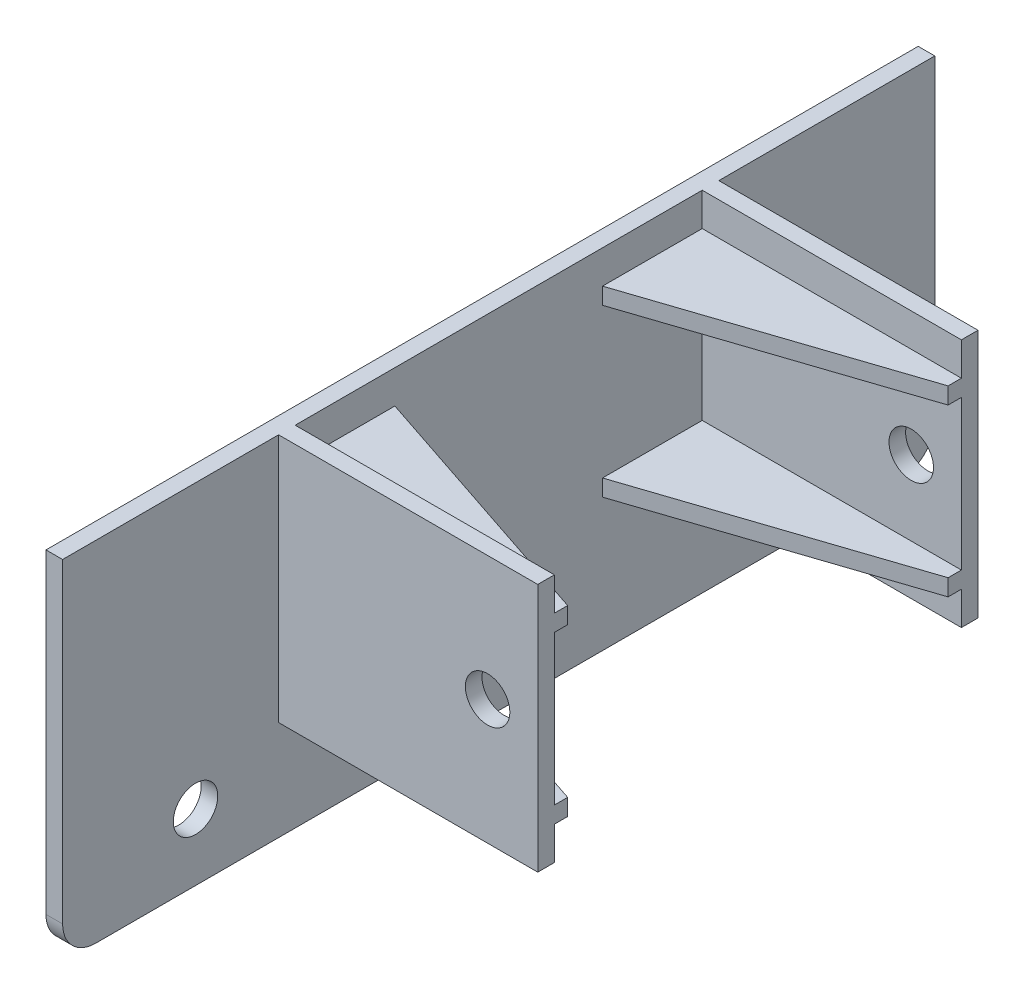
ISO-10303-21;
HEADER;
FILE_DESCRIPTION(('STEP AP214'),'2;1');
FILE_NAME('part.step','',(''),(''),'','','');
FILE_SCHEMA(('AUTOMOTIVE_DESIGN { 1 0 10303 214 1 1 1 1 }'));
ENDSEC;
DATA;
#1=APPLICATION_CONTEXT('core data for automotive mechanical design processes');
#2=APPLICATION_PROTOCOL_DEFINITION('international standard','automotive_design',2000,#1);
#3=PRODUCT_CONTEXT('',#1,'mechanical');
#4=PRODUCT('Part','Part','',(#3));
#5=PRODUCT_RELATED_PRODUCT_CATEGORY('part','',(#4));
#6=PRODUCT_DEFINITION_FORMATION('','',#4);
#7=PRODUCT_DEFINITION_CONTEXT('part definition',#1,'design');
#8=PRODUCT_DEFINITION('design','',#6,#7);
#9=PRODUCT_DEFINITION_SHAPE('','',#8);
#10=(LENGTH_UNIT() NAMED_UNIT(*) SI_UNIT(.MILLI.,.METRE.));
#11=(NAMED_UNIT(*) PLANE_ANGLE_UNIT() SI_UNIT($,.RADIAN.));
#12=(NAMED_UNIT(*) SI_UNIT($,.STERADIAN.) SOLID_ANGLE_UNIT());
#13=UNCERTAINTY_MEASURE_WITH_UNIT(LENGTH_MEASURE(1.E-05),#10,'distance_accuracy_value','');
#14=(GEOMETRIC_REPRESENTATION_CONTEXT(3) GLOBAL_UNCERTAINTY_ASSIGNED_CONTEXT((#13)) GLOBAL_UNIT_ASSIGNED_CONTEXT((#10,
#11,#12)) REPRESENTATION_CONTEXT('',''));
#15=CARTESIAN_POINT('',(0.,0.,0.));
#16=DIRECTION('',(0.,0.,1.));
#17=DIRECTION('',(1.,0.,0.));
#18=AXIS2_PLACEMENT_3D('',#15,#16,#17);
#19=CARTESIAN_POINT('',(0.,0.,66.675));
#20=DIRECTION('',(-1.,0.,0.));
#21=DIRECTION('',(0.,0.,1.));
#22=AXIS2_PLACEMENT_3D('',#19,#20,#21);
#23=PLANE('',#22);
#24=DIRECTION('',(0.,0.,-1.));
#25=VECTOR('',#24,1.);
#26=CARTESIAN_POINT('',(0.,22.86,17.78));
#27=LINE('',#26,#25);
#28=CARTESIAN_POINT('',(0.,22.86,25.4));
#29=VERTEX_POINT('',#28);
#30=CARTESIAN_POINT('',(0.,22.86,17.78));
#31=VERTEX_POINT('',#30);
#32=EDGE_CURVE('E347',#29,#31,#27,.T.);
#33=ORIENTED_EDGE('',*,*,#32,.F.);
#34=DIRECTION('',(0.,-1.,0.));
#35=VECTOR('',#34,1.);
#36=CARTESIAN_POINT('',(0.,24.13,25.4));
#37=LINE('',#36,#35);
#38=CARTESIAN_POINT('',(0.,24.13,25.4));
#39=VERTEX_POINT('',#38);
#40=EDGE_CURVE('E343',#39,#29,#37,.T.);
#41=ORIENTED_EDGE('',*,*,#40,.F.);
#42=DIRECTION('',(0.,0.,1.));
#43=VECTOR('',#42,1.);
#44=CARTESIAN_POINT('',(0.,24.13,17.78));
#45=LINE('',#44,#43);
#46=CARTESIAN_POINT('',(0.,24.13,17.78));
#47=VERTEX_POINT('',#46);
#48=EDGE_CURVE('E339',#47,#39,#45,.T.);
#49=ORIENTED_EDGE('',*,*,#48,.F.);
#50=DIRECTION('',(0.,1.,0.));
#51=VECTOR('',#50,1.);
#52=CARTESIAN_POINT('',(0.,7.61999999999998,17.78));
#53=LINE('',#52,#51);
#54=CARTESIAN_POINT('',(0.,26.67,17.78));
#55=VERTEX_POINT('',#54);
#56=EDGE_CURVE('E411',#47,#55,#53,.T.);
#57=ORIENTED_EDGE('',*,*,#56,.T.);
#58=DIRECTION('',(0.,0.,1.));
#59=VECTOR('',#58,1.);
#60=CARTESIAN_POINT('',(0.,26.67,66.675));
#61=LINE('',#60,#59);
#62=CARTESIAN_POINT('',(0.,26.67,48.895));
#63=VERTEX_POINT('',#62);
#64=EDGE_CURVE('E269',#55,#63,#61,.T.);
#65=ORIENTED_EDGE('',*,*,#64,.T.);
#66=DIRECTION('',(0.,1.,0.));
#67=VECTOR('',#66,1.);
#68=CARTESIAN_POINT('',(0.,7.61999999999998,48.895));
#69=LINE('',#68,#67);
#70=CARTESIAN_POINT('',(0.,24.13,48.895));
#71=VERTEX_POINT('',#70);
#72=EDGE_CURVE('E428',#71,#63,#69,.T.);
#73=ORIENTED_EDGE('',*,*,#72,.F.);
#74=DIRECTION('',(0.,0.,1.));
#75=VECTOR('',#74,1.);
#76=CARTESIAN_POINT('',(0.,24.13,48.895));
#77=LINE('',#76,#75);
#78=CARTESIAN_POINT('',(0.,24.13,41.275));
#79=VERTEX_POINT('',#78);
#80=EDGE_CURVE('E329',#79,#71,#77,.T.);
#81=ORIENTED_EDGE('',*,*,#80,.F.);
#82=DIRECTION('',(0.,1.,0.));
#83=VECTOR('',#82,1.);
#84=CARTESIAN_POINT('',(0.,24.13,41.275));
#85=LINE('',#84,#83);
#86=CARTESIAN_POINT('',(0.,22.86,41.275));
#87=VERTEX_POINT('',#86);
#88=EDGE_CURVE('E325',#87,#79,#85,.T.);
#89=ORIENTED_EDGE('',*,*,#88,.F.);
#90=DIRECTION('',(0.,0.,-1.));
#91=VECTOR('',#90,1.);
#92=CARTESIAN_POINT('',(0.,22.86,48.895));
#93=LINE('',#92,#91);
#94=CARTESIAN_POINT('',(0.,22.86,48.895));
#95=VERTEX_POINT('',#94);
#96=EDGE_CURVE('E321',#95,#87,#93,.T.);
#97=ORIENTED_EDGE('',*,*,#96,.F.);
#98=CARTESIAN_POINT('',(0.,11.43,48.895));
#99=VERTEX_POINT('',#98);
#100=EDGE_CURVE('E434',#99,#95,#69,.T.);
#101=ORIENTED_EDGE('',*,*,#100,.F.);
#102=DIRECTION('',(0.,0.,1.));
#103=VECTOR('',#102,1.);
#104=CARTESIAN_POINT('',(0.,11.43,48.895));
#105=LINE('',#104,#103);
#106=CARTESIAN_POINT('',(0.,11.43,41.275));
#107=VERTEX_POINT('',#106);
#108=EDGE_CURVE('E382',#107,#99,#105,.T.);
#109=ORIENTED_EDGE('',*,*,#108,.F.);
#110=DIRECTION('',(0.,1.,0.));
#111=VECTOR('',#110,1.);
#112=CARTESIAN_POINT('',(0.,10.16,41.275));
#113=LINE('',#112,#111);
#114=CARTESIAN_POINT('',(0.,10.16,41.275));
#115=VERTEX_POINT('',#114);
#116=EDGE_CURVE('E378',#115,#107,#113,.T.);
#117=ORIENTED_EDGE('',*,*,#116,.F.);
#118=DIRECTION('',(0.,0.,-1.));
#119=VECTOR('',#118,1.);
#120=CARTESIAN_POINT('',(0.,10.16,48.895));
#121=LINE('',#120,#119);
#122=CARTESIAN_POINT('',(0.,10.16,48.895));
#123=VERTEX_POINT('',#122);
#124=EDGE_CURVE('E374',#123,#115,#121,.T.);
#125=ORIENTED_EDGE('',*,*,#124,.F.);
#126=CARTESIAN_POINT('',(0.,7.61999999999998,48.895));
#127=VERTEX_POINT('',#126);
#128=EDGE_CURVE('E429',#127,#123,#69,.T.);
#129=ORIENTED_EDGE('',*,*,#128,.F.);
#130=DIRECTION('',(0.,0.,-1.));
#131=VECTOR('',#130,1.);
#132=CARTESIAN_POINT('',(0.,7.61999999999998,50.165));
#133=LINE('',#132,#131);
#134=CARTESIAN_POINT('',(0.,7.61999999999998,50.165));
#135=VERTEX_POINT('',#134);
#136=EDGE_CURVE('E420',#135,#127,#133,.T.);
#137=ORIENTED_EDGE('',*,*,#136,.F.);
#138=DIRECTION('',(0.,1.,0.));
#139=VECTOR('',#138,1.);
#140=CARTESIAN_POINT('',(0.,7.61999999999998,50.165));
#141=LINE('',#140,#139);
#142=CARTESIAN_POINT('',(0.,26.67,50.165));
#143=VERTEX_POINT('',#142);
#144=EDGE_CURVE('E433',#135,#143,#141,.T.);
#145=ORIENTED_EDGE('',*,*,#144,.T.);
#146=DIRECTION('',(0.,0.,1.));
#147=VECTOR('',#146,1.);
#148=CARTESIAN_POINT('',(0.,26.67,66.675));
#149=LINE('',#148,#147);
#150=CARTESIAN_POINT('',(0.,26.67,66.675));
#151=VERTEX_POINT('',#150);
#152=EDGE_CURVE('E395',#143,#151,#149,.T.);
#153=ORIENTED_EDGE('',*,*,#152,.T.);
#154=DIRECTION('',(0.,1.,0.));
#155=VECTOR('',#154,1.);
#156=CARTESIAN_POINT('',(0.,0.,66.675));
#157=LINE('',#156,#155);
#158=CARTESIAN_POINT('',(0.,2.54,66.675));
#159=VERTEX_POINT('',#158);
#160=EDGE_CURVE('E463',#159,#151,#157,.T.);
#161=ORIENTED_EDGE('',*,*,#160,.F.);
#162=CARTESIAN_POINT('',(0.,2.54,64.135));
#163=DIRECTION('',(-1.,0.,0.));
#164=DIRECTION('',(0.,0.,1.));
#165=AXIS2_PLACEMENT_3D('',#162,#163,#164);
#166=CIRCLE('',#165,2.54);
#167=CARTESIAN_POINT('',(0.,0.,64.135));
#168=VERTEX_POINT('',#167);
#169=EDGE_CURVE('E503',#159,#168,#166,.F.);
#170=ORIENTED_EDGE('',*,*,#169,.T.);
#171=DIRECTION('',(0.,0.,-1.));
#172=VECTOR('',#171,1.);
#173=CARTESIAN_POINT('',(0.,0.,66.675));
#174=LINE('',#173,#172);
#175=CARTESIAN_POINT('',(0.,0.,2.54));
#176=VERTEX_POINT('',#175);
#177=EDGE_CURVE('E475',#168,#176,#174,.T.);
#178=ORIENTED_EDGE('',*,*,#177,.T.);
#179=CARTESIAN_POINT('',(0.,2.54,2.54));
#180=DIRECTION('',(-1.,0.,0.));
#181=DIRECTION('',(0.,0.,1.));
#182=AXIS2_PLACEMENT_3D('',#179,#180,#181);
#183=CIRCLE('',#182,2.54);
#184=CARTESIAN_POINT('',(0.,2.54,0.));
#185=VERTEX_POINT('',#184);
#186=EDGE_CURVE('E506',#176,#185,#183,.F.);
#187=ORIENTED_EDGE('',*,*,#186,.T.);
#188=DIRECTION('',(0.,1.,0.));
#189=VECTOR('',#188,1.);
#190=CARTESIAN_POINT('',(0.,0.,0.));
#191=LINE('',#190,#189);
#192=CARTESIAN_POINT('',(0.,26.67,0.));
#193=VERTEX_POINT('',#192);
#194=EDGE_CURVE('E459',#185,#193,#191,.T.);
#195=ORIENTED_EDGE('',*,*,#194,.T.);
#196=DIRECTION('',(0.,0.,1.));
#197=VECTOR('',#196,1.);
#198=CARTESIAN_POINT('',(0.,26.67,66.675));
#199=LINE('',#198,#197);
#200=CARTESIAN_POINT('',(0.,26.67,16.51));
#201=VERTEX_POINT('',#200);
#202=EDGE_CURVE('E392',#193,#201,#199,.T.);
#203=ORIENTED_EDGE('',*,*,#202,.T.);
#204=DIRECTION('',(0.,1.,0.));
#205=VECTOR('',#204,1.);
#206=CARTESIAN_POINT('',(0.,7.61999999999998,16.51));
#207=LINE('',#206,#205);
#208=CARTESIAN_POINT('',(0.,7.61999999999998,16.51));
#209=VERTEX_POINT('',#208);
#210=EDGE_CURVE('E261',#209,#201,#207,.T.);
#211=ORIENTED_EDGE('',*,*,#210,.F.);
#212=DIRECTION('',(0.,0.,-1.));
#213=VECTOR('',#212,1.);
#214=CARTESIAN_POINT('',(0.,7.61999999999998,16.51));
#215=LINE('',#214,#213);
#216=CARTESIAN_POINT('',(0.,7.61999999999998,17.78));
#217=VERTEX_POINT('',#216);
#218=EDGE_CURVE('E402',#217,#209,#215,.T.);
#219=ORIENTED_EDGE('',*,*,#218,.F.);
#220=CARTESIAN_POINT('',(0.,10.16,17.78));
#221=VERTEX_POINT('',#220);
#222=EDGE_CURVE('E412',#217,#221,#53,.T.);
#223=ORIENTED_EDGE('',*,*,#222,.T.);
#224=DIRECTION('',(0.,0.,-1.));
#225=VECTOR('',#224,1.);
#226=CARTESIAN_POINT('',(0.,10.16,17.78));
#227=LINE('',#226,#225);
#228=CARTESIAN_POINT('',(0.,10.16,25.4));
#229=VERTEX_POINT('',#228);
#230=EDGE_CURVE('E364',#229,#221,#227,.T.);
#231=ORIENTED_EDGE('',*,*,#230,.F.);
#232=DIRECTION('',(0.,-1.,0.));
#233=VECTOR('',#232,1.);
#234=CARTESIAN_POINT('',(0.,10.16,25.4));
#235=LINE('',#234,#233);
#236=CARTESIAN_POINT('',(0.,11.43,25.4));
#237=VERTEX_POINT('',#236);
#238=EDGE_CURVE('E361',#237,#229,#235,.T.);
#239=ORIENTED_EDGE('',*,*,#238,.F.);
#240=DIRECTION('',(0.,0.,1.));
#241=VECTOR('',#240,1.);
#242=CARTESIAN_POINT('',(0.,11.43,17.78));
#243=LINE('',#242,#241);
#244=CARTESIAN_POINT('',(0.,11.43,17.78));
#245=VERTEX_POINT('',#244);
#246=EDGE_CURVE('E357',#245,#237,#243,.T.);
#247=ORIENTED_EDGE('',*,*,#246,.F.);
#248=EDGE_CURVE('E417',#245,#31,#53,.T.);
#249=ORIENTED_EDGE('',*,*,#248,.T.);
#250=EDGE_LOOP('',(#33,#41,#49,#57,#65,#73,#81,#89,#97,#101,#109,#117,#125,#129,#137,#145,#153,
#161,#170,#178,#187,#195,#203,#211,#219,#223,#231,#239,#247,#249));
#251=FACE_BOUND('',#250,.T.);
#252=CARTESIAN_POINT('',(0.,5.08,10.16));
#253=DIRECTION('',(-1.,0.,0.));
#254=DIRECTION('',(0.,0.,1.));
#255=AXIS2_PLACEMENT_3D('',#252,#253,#254);
#256=CIRCLE('',#255,1.7);
#257=CARTESIAN_POINT('',(0.,5.08,11.86));
#258=VERTEX_POINT('',#257);
#259=EDGE_CURVE('E450',#258,#258,#256,.T.);
#260=ORIENTED_EDGE('',*,*,#259,.T.);
#261=EDGE_LOOP('',(#260));
#262=FACE_BOUND('',#261,.T.);
#263=CARTESIAN_POINT('',(0.,5.08,56.515));
#264=DIRECTION('',(-1.,0.,0.));
#265=DIRECTION('',(0.,0.,1.));
#266=AXIS2_PLACEMENT_3D('',#263,#264,#265);
#267=CIRCLE('',#266,1.7);
#268=CARTESIAN_POINT('',(0.,5.08,58.215));
#269=VERTEX_POINT('',#268);
#270=EDGE_CURVE('E443',#269,#269,#267,.T.);
#271=ORIENTED_EDGE('',*,*,#270,.T.);
#272=EDGE_LOOP('',(#271));
#273=FACE_BOUND('',#272,.T.);
#274=ADVANCED_FACE('F40',(#251,#262,#273),#23,.F.);
#275=CARTESIAN_POINT('',(22.86,7.61999999999998,48.895));
#276=DIRECTION('',(0.,0.,1.));
#277=DIRECTION('',(1.,0.,0.));
#278=AXIS2_PLACEMENT_3D('',#275,#276,#277);
#279=PLANE('',#278);
#280=CARTESIAN_POINT('',(15.9783518217895,17.145,48.895));
#281=DIRECTION('',(0.,0.,1.));
#282=DIRECTION('',(1.,0.,0.));
#283=AXIS2_PLACEMENT_3D('',#280,#281,#282);
#284=CIRCLE('',#283,1.7);
#285=CARTESIAN_POINT('',(17.6783518217895,17.145,48.895));
#286=VERTEX_POINT('',#285);
#287=EDGE_CURVE('E284',#286,#286,#284,.T.);
#288=ORIENTED_EDGE('',*,*,#287,.T.);
#289=EDGE_LOOP('',(#288));
#290=FACE_BOUND('',#289,.T.);
#291=DIRECTION('',(-1.,0.,0.));
#292=VECTOR('',#291,1.);
#293=CARTESIAN_POINT('',(22.86,22.86,48.895));
#294=LINE('',#293,#292);
#295=CARTESIAN_POINT('',(19.812,22.86,48.895));
#296=VERTEX_POINT('',#295);
#297=EDGE_CURVE('E336',#296,#95,#294,.T.);
#298=ORIENTED_EDGE('',*,*,#297,.F.);
#299=DIRECTION('',(0.,-1.,0.));
#300=VECTOR('',#299,1.);
#301=CARTESIAN_POINT('',(19.812,7.61999999999998,48.895));
#302=LINE('',#301,#300);
#303=CARTESIAN_POINT('',(19.812,11.43,48.895));
#304=VERTEX_POINT('',#303);
#305=EDGE_CURVE('E552',#296,#304,#302,.T.);
#306=ORIENTED_EDGE('',*,*,#305,.T.);
#307=DIRECTION('',(-1.,0.,0.));
#308=VECTOR('',#307,1.);
#309=CARTESIAN_POINT('',(22.86,11.43,48.895));
#310=LINE('',#309,#308);
#311=EDGE_CURVE('E386',#304,#99,#310,.T.);
#312=ORIENTED_EDGE('',*,*,#311,.T.);
#313=ORIENTED_EDGE('',*,*,#100,.T.);
#314=EDGE_LOOP('',(#298,#306,#312,#313));
#315=FACE_BOUND('',#314,.T.);
#316=ADVANCED_FACE('F684',(#290,#315),#279,.F.);
#317=DIRECTION('',(1.,0.,0.));
#318=VECTOR('',#317,1.);
#319=CARTESIAN_POINT('',(-1.27000000000001,26.67,48.895));
#320=LINE('',#319,#318);
#321=CARTESIAN_POINT('',(19.812,26.67,48.895));
#322=VERTEX_POINT('',#321);
#323=EDGE_CURVE('E515',#63,#322,#320,.T.);
#324=ORIENTED_EDGE('',*,*,#323,.T.);
#325=DIRECTION('',(0.,-1.,0.));
#326=VECTOR('',#325,1.);
#327=CARTESIAN_POINT('',(19.812,7.61999999999998,48.895));
#328=LINE('',#327,#326);
#329=CARTESIAN_POINT('',(19.812,24.13,48.895));
#330=VERTEX_POINT('',#329);
#331=EDGE_CURVE('E572',#322,#330,#328,.T.);
#332=ORIENTED_EDGE('',*,*,#331,.T.);
#333=DIRECTION('',(-1.,0.,0.));
#334=VECTOR('',#333,1.);
#335=CARTESIAN_POINT('',(22.86,24.13,48.895));
#336=LINE('',#335,#334);
#337=EDGE_CURVE('E333',#330,#71,#336,.T.);
#338=ORIENTED_EDGE('',*,*,#337,.T.);
#339=ORIENTED_EDGE('',*,*,#72,.T.);
#340=EDGE_LOOP('',(#324,#332,#338,#339));
#341=FACE_BOUND('',#340,.T.);
#342=ADVANCED_FACE('F530',(#341),#279,.F.);
#343=CARTESIAN_POINT('',(22.86,7.61999999999998,17.78));
#344=DIRECTION('',(0.,0.,-1.));
#345=DIRECTION('',(-1.,0.,0.));
#346=AXIS2_PLACEMENT_3D('',#343,#344,#345);
#347=PLANE('',#346);
#348=DIRECTION('',(-1.,0.,0.));
#349=VECTOR('',#348,1.);
#350=CARTESIAN_POINT('',(22.86,24.13,17.78));
#351=LINE('',#350,#349);
#352=CARTESIAN_POINT('',(19.812,24.13,17.78));
#353=VERTEX_POINT('',#352);
#354=EDGE_CURVE('E351',#353,#47,#351,.T.);
#355=ORIENTED_EDGE('',*,*,#354,.F.);
#356=DIRECTION('',(0.,1.,0.));
#357=VECTOR('',#356,1.);
#358=CARTESIAN_POINT('',(19.812,7.61999999999998,17.78));
#359=LINE('',#358,#357);
#360=CARTESIAN_POINT('',(19.812,26.67,17.78));
#361=VERTEX_POINT('',#360);
#362=EDGE_CURVE('E287',#353,#361,#359,.T.);
#363=ORIENTED_EDGE('',*,*,#362,.T.);
#364=DIRECTION('',(-1.,0.,0.));
#365=VECTOR('',#364,1.);
#366=CARTESIAN_POINT('',(-1.26999999999997,26.67,17.78));
#367=LINE('',#366,#365);
#368=EDGE_CURVE('E256',#361,#55,#367,.T.);
#369=ORIENTED_EDGE('',*,*,#368,.T.);
#370=ORIENTED_EDGE('',*,*,#56,.F.);
#371=EDGE_LOOP('',(#355,#363,#369,#370));
#372=FACE_BOUND('',#371,.T.);
#373=ADVANCED_FACE('F607',(#372),#347,.F.);
#374=CARTESIAN_POINT('',(15.9783518217895,17.145,17.78));
#375=DIRECTION('',(0.,0.,-1.));
#376=DIRECTION('',(-1.,0.,0.));
#377=AXIS2_PLACEMENT_3D('',#374,#375,#376);
#378=CIRCLE('',#377,1.7);
#379=CARTESIAN_POINT('',(14.2783518217895,17.145,17.78));
#380=VERTEX_POINT('',#379);
#381=EDGE_CURVE('E277',#380,#380,#378,.T.);
#382=ORIENTED_EDGE('',*,*,#381,.T.);
#383=EDGE_LOOP('',(#382));
#384=FACE_BOUND('',#383,.T.);
#385=DIRECTION('',(-1.,0.,0.));
#386=VECTOR('',#385,1.);
#387=CARTESIAN_POINT('',(22.86,11.43,17.78));
#388=LINE('',#387,#386);
#389=CARTESIAN_POINT('',(19.812,11.43,17.78));
#390=VERTEX_POINT('',#389);
#391=EDGE_CURVE('E371',#390,#245,#388,.T.);
#392=ORIENTED_EDGE('',*,*,#391,.F.);
#393=DIRECTION('',(0.,1.,0.));
#394=VECTOR('',#393,1.);
#395=CARTESIAN_POINT('',(19.812,7.61999999999998,17.78));
#396=LINE('',#395,#394);
#397=CARTESIAN_POINT('',(19.812,22.86,17.78));
#398=VERTEX_POINT('',#397);
#399=EDGE_CURVE('E588',#390,#398,#396,.T.);
#400=ORIENTED_EDGE('',*,*,#399,.T.);
#401=DIRECTION('',(-1.,0.,0.));
#402=VECTOR('',#401,1.);
#403=CARTESIAN_POINT('',(22.86,22.86,17.78));
#404=LINE('',#403,#402);
#405=EDGE_CURVE('E354',#398,#31,#404,.T.);
#406=ORIENTED_EDGE('',*,*,#405,.T.);
#407=ORIENTED_EDGE('',*,*,#248,.F.);
#408=EDGE_LOOP('',(#392,#400,#406,#407));
#409=FACE_BOUND('',#408,.T.);
#410=ADVANCED_FACE('F623',(#384,#409),#347,.F.);
#411=DIRECTION('',(-1.,0.,0.));
#412=VECTOR('',#411,1.);
#413=CARTESIAN_POINT('',(22.86,7.61999999999998,17.78));
#414=LINE('',#413,#412);
#415=CARTESIAN_POINT('',(19.812,7.61999999999998,17.78));
#416=VERTEX_POINT('',#415);
#417=EDGE_CURVE('E399',#416,#217,#414,.T.);
#418=ORIENTED_EDGE('',*,*,#417,.F.);
#419=DIRECTION('',(0.,1.,0.));
#420=VECTOR('',#419,1.);
#421=CARTESIAN_POINT('',(19.812,7.61999999999998,17.78));
#422=LINE('',#421,#420);
#423=CARTESIAN_POINT('',(19.812,10.16,17.78));
#424=VERTEX_POINT('',#423);
#425=EDGE_CURVE('E584',#416,#424,#422,.T.);
#426=ORIENTED_EDGE('',*,*,#425,.T.);
#427=DIRECTION('',(-1.,0.,0.));
#428=VECTOR('',#427,1.);
#429=CARTESIAN_POINT('',(22.86,10.16,17.78));
#430=LINE('',#429,#428);
#431=EDGE_CURVE('E368',#424,#221,#430,.T.);
#432=ORIENTED_EDGE('',*,*,#431,.T.);
#433=ORIENTED_EDGE('',*,*,#222,.F.);
#434=EDGE_LOOP('',(#418,#426,#432,#433));
#435=FACE_BOUND('',#434,.T.);
#436=ADVANCED_FACE('F637',(#435),#347,.F.);
#437=DIRECTION('',(-1.,0.,0.));
#438=VECTOR('',#437,1.);
#439=CARTESIAN_POINT('',(22.86,10.16,48.895));
#440=LINE('',#439,#438);
#441=CARTESIAN_POINT('',(19.812,10.16,48.895));
#442=VERTEX_POINT('',#441);
#443=EDGE_CURVE('E389',#442,#123,#440,.T.);
#444=ORIENTED_EDGE('',*,*,#443,.F.);
#445=DIRECTION('',(0.,-1.,0.));
#446=VECTOR('',#445,1.);
#447=CARTESIAN_POINT('',(19.812,7.61999999999998,48.895));
#448=LINE('',#447,#446);
#449=CARTESIAN_POINT('',(19.812,7.61999999999998,48.895));
#450=VERTEX_POINT('',#449);
#451=EDGE_CURVE('E548',#442,#450,#448,.T.);
#452=ORIENTED_EDGE('',*,*,#451,.T.);
#453=DIRECTION('',(1.,0.,0.));
#454=VECTOR('',#453,1.);
#455=CARTESIAN_POINT('',(22.86,7.61999999999998,48.895));
#456=LINE('',#455,#454);
#457=EDGE_CURVE('E424',#127,#450,#456,.T.);
#458=ORIENTED_EDGE('',*,*,#457,.F.);
#459=ORIENTED_EDGE('',*,*,#128,.T.);
#460=EDGE_LOOP('',(#444,#452,#458,#459));
#461=FACE_BOUND('',#460,.T.);
#462=ADVANCED_FACE('F667',(#461),#279,.F.);
#463=CARTESIAN_POINT('',(0.,0.,66.675));
#464=DIRECTION('',(0.,-1.,0.));
#465=DIRECTION('',(0.,0.,-1.));
#466=AXIS2_PLACEMENT_3D('',#463,#464,#465);
#467=PLANE('',#466);
#468=DIRECTION('',(0.,0.,-1.));
#469=VECTOR('',#468,1.);
#470=CARTESIAN_POINT('',(-1.27,0.,66.675));
#471=LINE('',#470,#469);
#472=CARTESIAN_POINT('',(-1.27,0.,64.135));
#473=VERTEX_POINT('',#472);
#474=CARTESIAN_POINT('',(-1.27,0.,2.54));
#475=VERTEX_POINT('',#474);
#476=EDGE_CURVE('E466',#473,#475,#471,.T.);
#477=ORIENTED_EDGE('',*,*,#476,.T.);
#478=DIRECTION('',(-1.,0.,0.));
#479=VECTOR('',#478,1.);
#480=CARTESIAN_POINT('',(0.,0.,2.54));
#481=LINE('',#480,#479);
#482=EDGE_CURVE('E500',#475,#176,#481,.F.);
#483=ORIENTED_EDGE('',*,*,#482,.T.);
#484=ORIENTED_EDGE('',*,*,#177,.F.);
#485=DIRECTION('',(-1.,0.,0.));
#486=VECTOR('',#485,1.);
#487=CARTESIAN_POINT('',(-1.27,0.,64.135));
#488=LINE('',#487,#486);
#489=EDGE_CURVE('E496',#168,#473,#488,.T.);
#490=ORIENTED_EDGE('',*,*,#489,.T.);
#491=EDGE_LOOP('',(#477,#483,#484,#490));
#492=FACE_BOUND('',#491,.T.);
#493=ADVANCED_FACE('F717',(#492),#467,.T.);
#494=CARTESIAN_POINT('',(-1.27,26.67,66.675));
#495=DIRECTION('',(0.,1.,0.));
#496=DIRECTION('',(0.,0.,1.));
#497=AXIS2_PLACEMENT_3D('',#494,#495,#496);
#498=PLANE('',#497);
#499=DIRECTION('',(0.,0.,1.));
#500=VECTOR('',#499,1.);
#501=CARTESIAN_POINT('',(19.812,26.67,16.51));
#502=LINE('',#501,#500);
#503=CARTESIAN_POINT('',(19.812,26.67,16.51));
#504=VERTEX_POINT('',#503);
#505=EDGE_CURVE('E238',#504,#361,#502,.T.);
#506=ORIENTED_EDGE('',*,*,#505,.F.);
#507=DIRECTION('',(1.,0.,0.));
#508=VECTOR('',#507,1.);
#509=CARTESIAN_POINT('',(-1.27,26.67,16.51));
#510=LINE('',#509,#508);
#511=EDGE_CURVE('E254',#201,#504,#510,.T.);
#512=ORIENTED_EDGE('',*,*,#511,.F.);
#513=ORIENTED_EDGE('',*,*,#202,.F.);
#514=DIRECTION('',(1.,0.,0.));
#515=VECTOR('',#514,1.);
#516=CARTESIAN_POINT('',(-1.27,26.67,0.));
#517=LINE('',#516,#515);
#518=CARTESIAN_POINT('',(-1.27,26.67,0.));
#519=VERTEX_POINT('',#518);
#520=EDGE_CURVE('E469',#519,#193,#517,.T.);
#521=ORIENTED_EDGE('',*,*,#520,.F.);
#522=DIRECTION('',(0.,0.,-1.));
#523=VECTOR('',#522,1.);
#524=CARTESIAN_POINT('',(-1.27,26.67,66.675));
#525=LINE('',#524,#523);
#526=CARTESIAN_POINT('',(-1.27,26.67,66.675));
#527=VERTEX_POINT('',#526);
#528=EDGE_CURVE('E480',#527,#519,#525,.T.);
#529=ORIENTED_EDGE('',*,*,#528,.F.);
#530=DIRECTION('',(1.,0.,0.));
#531=VECTOR('',#530,1.);
#532=CARTESIAN_POINT('',(-1.27,26.67,66.675));
#533=LINE('',#532,#531);
#534=EDGE_CURVE('E458',#527,#151,#533,.T.);
#535=ORIENTED_EDGE('',*,*,#534,.T.);
#536=ORIENTED_EDGE('',*,*,#152,.F.);
#537=DIRECTION('',(-1.,0.,0.));
#538=VECTOR('',#537,1.);
#539=CARTESIAN_POINT('',(-1.27,26.67,50.165));
#540=LINE('',#539,#538);
#541=CARTESIAN_POINT('',(19.812,26.67,50.165));
#542=VERTEX_POINT('',#541);
#543=EDGE_CURVE('E512',#542,#143,#540,.T.);
#544=ORIENTED_EDGE('',*,*,#543,.F.);
#545=EDGE_CURVE('E258',#322,#542,#502,.T.);
#546=ORIENTED_EDGE('',*,*,#545,.F.);
#547=ORIENTED_EDGE('',*,*,#323,.F.);
#548=ORIENTED_EDGE('',*,*,#64,.F.);
#549=ORIENTED_EDGE('',*,*,#368,.F.);
#550=EDGE_LOOP('',(#506,#512,#513,#521,#529,#535,#536,#544,#546,#547,#548,#549));
#551=FACE_BOUND('',#550,.T.);
#552=ADVANCED_FACE('F252',(#551),#498,.T.);
#553=CARTESIAN_POINT('',(-1.27,0.,66.675));
#554=DIRECTION('',(-1.,0.,0.));
#555=DIRECTION('',(0.,-1.,0.));
#556=AXIS2_PLACEMENT_3D('',#553,#554,#555);
#557=PLANE('',#556);
#558=CARTESIAN_POINT('',(-1.27,5.08,10.16));
#559=DIRECTION('',(-1.,0.,0.));
#560=DIRECTION('',(0.,-1.,0.));
#561=AXIS2_PLACEMENT_3D('',#558,#559,#560);
#562=CIRCLE('',#561,1.7);
#563=CARTESIAN_POINT('',(-1.27,3.38,10.16));
#564=VERTEX_POINT('',#563);
#565=EDGE_CURVE('E439',#564,#564,#562,.T.);
#566=ORIENTED_EDGE('',*,*,#565,.F.);
#567=EDGE_LOOP('',(#566));
#568=FACE_BOUND('',#567,.T.);
#569=CARTESIAN_POINT('',(-1.27,5.08,56.515));
#570=DIRECTION('',(-1.,0.,0.));
#571=DIRECTION('',(0.,1.,0.));
#572=AXIS2_PLACEMENT_3D('',#569,#570,#571);
#573=CIRCLE('',#572,1.7);
#574=CARTESIAN_POINT('',(-1.27,6.78,56.515));
#575=VERTEX_POINT('',#574);
#576=EDGE_CURVE('E438',#575,#575,#573,.T.);
#577=ORIENTED_EDGE('',*,*,#576,.F.);
#578=EDGE_LOOP('',(#577));
#579=FACE_BOUND('',#578,.T.);
#580=DIRECTION('',(0.,1.,0.));
#581=VECTOR('',#580,1.);
#582=CARTESIAN_POINT('',(-1.27,0.,0.));
#583=LINE('',#582,#581);
#584=CARTESIAN_POINT('',(-1.27,2.54,0.));
#585=VERTEX_POINT('',#584);
#586=EDGE_CURVE('E454',#585,#519,#583,.T.);
#587=ORIENTED_EDGE('',*,*,#586,.F.);
#588=CARTESIAN_POINT('',(-1.27,2.54,2.54));
#589=DIRECTION('',(-1.,0.,0.));
#590=DIRECTION('',(0.,-1.,0.));
#591=AXIS2_PLACEMENT_3D('',#588,#589,#590);
#592=CIRCLE('',#591,2.54);
#593=EDGE_CURVE('E493',#585,#475,#592,.T.);
#594=ORIENTED_EDGE('',*,*,#593,.T.);
#595=ORIENTED_EDGE('',*,*,#476,.F.);
#596=CARTESIAN_POINT('',(-1.27,2.54,64.135));
#597=DIRECTION('',(-1.,0.,0.));
#598=DIRECTION('',(0.,-1.,0.));
#599=AXIS2_PLACEMENT_3D('',#596,#597,#598);
#600=CIRCLE('',#599,2.54);
#601=CARTESIAN_POINT('',(-1.27,2.54,66.675));
#602=VERTEX_POINT('',#601);
#603=EDGE_CURVE('E490',#473,#602,#600,.T.);
#604=ORIENTED_EDGE('',*,*,#603,.T.);
#605=DIRECTION('',(0.,1.,0.));
#606=VECTOR('',#605,1.);
#607=CARTESIAN_POINT('',(-1.27,0.,66.675));
#608=LINE('',#607,#606);
#609=EDGE_CURVE('E455',#602,#527,#608,.T.);
#610=ORIENTED_EDGE('',*,*,#609,.T.);
#611=ORIENTED_EDGE('',*,*,#528,.T.);
#612=EDGE_LOOP('',(#587,#594,#595,#604,#610,#611));
#613=FACE_BOUND('',#612,.T.);
#614=ADVANCED_FACE('F648',(#568,#579,#613),#557,.T.);
#615=CARTESIAN_POINT('',(0.,0.,66.675));
#616=DIRECTION('',(0.,0.,-1.));
#617=DIRECTION('',(-1.,0.,0.));
#618=AXIS2_PLACEMENT_3D('',#615,#616,#617);
#619=PLANE('',#618);
#620=ORIENTED_EDGE('',*,*,#160,.T.);
#621=ORIENTED_EDGE('',*,*,#534,.F.);
#622=ORIENTED_EDGE('',*,*,#609,.F.);
#623=DIRECTION('',(-1.,0.,0.));
#624=VECTOR('',#623,1.);
#625=CARTESIAN_POINT('',(0.,2.54,66.675));
#626=LINE('',#625,#624);
#627=EDGE_CURVE('E509',#602,#159,#626,.F.);
#628=ORIENTED_EDGE('',*,*,#627,.T.);
#629=EDGE_LOOP('',(#620,#621,#622,#628));
#630=FACE_BOUND('',#629,.T.);
#631=ADVANCED_FACE('F652',(#630),#619,.F.);
#632=CARTESIAN_POINT('',(0.,0.,0.));
#633=DIRECTION('',(0.,0.,-1.));
#634=DIRECTION('',(-1.,0.,0.));
#635=AXIS2_PLACEMENT_3D('',#632,#633,#634);
#636=PLANE('',#635);
#637=ORIENTED_EDGE('',*,*,#520,.T.);
#638=ORIENTED_EDGE('',*,*,#194,.F.);
#639=DIRECTION('',(-1.,0.,0.));
#640=VECTOR('',#639,1.);
#641=CARTESIAN_POINT('',(0.,2.54,0.));
#642=LINE('',#641,#640);
#643=EDGE_CURVE('E479',#185,#585,#642,.T.);
#644=ORIENTED_EDGE('',*,*,#643,.T.);
#645=ORIENTED_EDGE('',*,*,#586,.T.);
#646=EDGE_LOOP('',(#637,#638,#644,#645));
#647=FACE_BOUND('',#646,.T.);
#648=ADVANCED_FACE('F644',(#647),#636,.T.);
#649=CARTESIAN_POINT('',(25.4,5.08,56.515));
#650=DIRECTION('',(-1.,0.,0.));
#651=DIRECTION('',(0.,-1.,0.));
#652=AXIS2_PLACEMENT_3D('',#649,#650,#651);
#653=CYLINDRICAL_SURFACE('',#652,1.7);
#654=ORIENTED_EDGE('',*,*,#576,.T.);
#655=EDGE_LOOP('',(#654));
#656=FACE_BOUND('',#655,.T.);
#657=ORIENTED_EDGE('',*,*,#270,.F.);
#658=EDGE_LOOP('',(#657));
#659=FACE_BOUND('',#658,.T.);
#660=ADVANCED_FACE('F732',(#656,#659),#653,.F.);
#661=CARTESIAN_POINT('',(25.4,5.08,10.16));
#662=DIRECTION('',(-1.,0.,0.));
#663=DIRECTION('',(0.,-1.,0.));
#664=AXIS2_PLACEMENT_3D('',#661,#662,#663);
#665=CYLINDRICAL_SURFACE('',#664,1.7);
#666=ORIENTED_EDGE('',*,*,#565,.T.);
#667=EDGE_LOOP('',(#666));
#668=FACE_BOUND('',#667,.T.);
#669=ORIENTED_EDGE('',*,*,#259,.F.);
#670=EDGE_LOOP('',(#669));
#671=FACE_BOUND('',#670,.T.);
#672=ADVANCED_FACE('F725',(#668,#671),#665,.F.);
#673=CARTESIAN_POINT('',(0.,2.54,2.54));
#674=DIRECTION('',(-1.,0.,0.));
#675=DIRECTION('',(0.,0.,1.));
#676=AXIS2_PLACEMENT_3D('',#673,#674,#675);
#677=CYLINDRICAL_SURFACE('',#676,2.54);
#678=ORIENTED_EDGE('',*,*,#186,.F.);
#679=ORIENTED_EDGE('',*,*,#482,.F.);
#680=ORIENTED_EDGE('',*,*,#593,.F.);
#681=ORIENTED_EDGE('',*,*,#643,.F.);
#682=EDGE_LOOP('',(#678,#679,#680,#681));
#683=FACE_BOUND('',#682,.T.);
#684=ADVANCED_FACE('F723',(#683),#677,.T.);
#685=CARTESIAN_POINT('',(0.,2.54,64.135));
#686=DIRECTION('',(1.,0.,0.));
#687=DIRECTION('',(0.,0.,-1.));
#688=AXIS2_PLACEMENT_3D('',#685,#686,#687);
#689=CYLINDRICAL_SURFACE('',#688,2.54);
#690=ORIENTED_EDGE('',*,*,#169,.F.);
#691=ORIENTED_EDGE('',*,*,#627,.F.);
#692=ORIENTED_EDGE('',*,*,#603,.F.);
#693=ORIENTED_EDGE('',*,*,#489,.F.);
#694=EDGE_LOOP('',(#690,#691,#692,#693));
#695=FACE_BOUND('',#694,.T.);
#696=ADVANCED_FACE('F42',(#695),#689,.T.);
#697=CARTESIAN_POINT('',(22.86,7.61999999999998,50.165));
#698=DIRECTION('',(0.,0.,-1.));
#699=DIRECTION('',(-1.,0.,0.));
#700=AXIS2_PLACEMENT_3D('',#697,#698,#699);
#701=PLANE('',#700);
#702=CARTESIAN_POINT('',(15.9783518217895,17.145,50.165));
#703=DIRECTION('',(0.,0.,1.));
#704=DIRECTION('',(1.,0.,0.));
#705=AXIS2_PLACEMENT_3D('',#702,#703,#704);
#706=CIRCLE('',#705,1.7);
#707=CARTESIAN_POINT('',(17.6783518217895,17.145,50.165));
#708=VERTEX_POINT('',#707);
#709=EDGE_CURVE('E278',#708,#708,#706,.T.);
#710=ORIENTED_EDGE('',*,*,#709,.F.);
#711=EDGE_LOOP('',(#710));
#712=FACE_BOUND('',#711,.T.);
#713=DIRECTION('',(-1.,0.,0.));
#714=VECTOR('',#713,1.);
#715=CARTESIAN_POINT('',(22.86,7.61999999999998,50.165));
#716=LINE('',#715,#714);
#717=CARTESIAN_POINT('',(19.812,7.61999999999998,50.165));
#718=VERTEX_POINT('',#717);
#719=EDGE_CURVE('E416',#718,#135,#716,.T.);
#720=ORIENTED_EDGE('',*,*,#719,.F.);
#721=DIRECTION('',(0.,1.,0.));
#722=VECTOR('',#721,1.);
#723=CARTESIAN_POINT('',(19.812,-16.51,50.165));
#724=LINE('',#723,#722);
#725=EDGE_CURVE('E247',#718,#542,#724,.T.);
#726=ORIENTED_EDGE('',*,*,#725,.T.);
#727=ORIENTED_EDGE('',*,*,#543,.T.);
#728=ORIENTED_EDGE('',*,*,#144,.F.);
#729=EDGE_LOOP('',(#720,#726,#727,#728));
#730=FACE_BOUND('',#729,.T.);
#731=ADVANCED_FACE('F660',(#712,#730),#701,.F.);
#732=CARTESIAN_POINT('',(0.,7.61999999999998,0.));
#733=DIRECTION('',(0.,1.,0.));
#734=DIRECTION('',(0.,0.,1.));
#735=AXIS2_PLACEMENT_3D('',#732,#733,#734);
#736=PLANE('',#735);
#737=ORIENTED_EDGE('',*,*,#457,.T.);
#738=DIRECTION('',(0.,0.,1.));
#739=VECTOR('',#738,1.);
#740=CARTESIAN_POINT('',(19.812,7.61999999999998,0.));
#741=LINE('',#740,#739);
#742=EDGE_CURVE('E560',#450,#718,#741,.T.);
#743=ORIENTED_EDGE('',*,*,#742,.T.);
#744=ORIENTED_EDGE('',*,*,#719,.T.);
#745=ORIENTED_EDGE('',*,*,#136,.T.);
#746=EDGE_LOOP('',(#737,#743,#744,#745));
#747=FACE_BOUND('',#746,.T.);
#748=ADVANCED_FACE('F663',(#747),#736,.F.);
#749=CARTESIAN_POINT('',(22.86,7.61999999999998,16.51));
#750=DIRECTION('',(0.,0.,1.));
#751=DIRECTION('',(1.,0.,0.));
#752=AXIS2_PLACEMENT_3D('',#749,#750,#751);
#753=PLANE('',#752);
#754=CARTESIAN_POINT('',(15.9783518217895,17.145,16.51));
#755=DIRECTION('',(0.,0.,1.));
#756=DIRECTION('',(1.,0.,0.));
#757=AXIS2_PLACEMENT_3D('',#754,#755,#756);
#758=CIRCLE('',#757,1.7);
#759=CARTESIAN_POINT('',(17.6783518217895,17.145,16.51));
#760=VERTEX_POINT('',#759);
#761=EDGE_CURVE('E274',#760,#760,#758,.T.);
#762=ORIENTED_EDGE('',*,*,#761,.T.);
#763=EDGE_LOOP('',(#762));
#764=FACE_BOUND('',#763,.T.);
#765=ORIENTED_EDGE('',*,*,#511,.T.);
#766=DIRECTION('',(0.,1.,0.));
#767=VECTOR('',#766,1.);
#768=CARTESIAN_POINT('',(19.812,-16.51,16.51));
#769=LINE('',#768,#767);
#770=CARTESIAN_POINT('',(19.812,7.61999999999998,16.51));
#771=VERTEX_POINT('',#770);
#772=EDGE_CURVE('E235',#771,#504,#769,.T.);
#773=ORIENTED_EDGE('',*,*,#772,.F.);
#774=DIRECTION('',(1.,0.,0.));
#775=VECTOR('',#774,1.);
#776=CARTESIAN_POINT('',(22.86,7.61999999999998,16.51));
#777=LINE('',#776,#775);
#778=EDGE_CURVE('E406',#209,#771,#777,.T.);
#779=ORIENTED_EDGE('',*,*,#778,.F.);
#780=ORIENTED_EDGE('',*,*,#210,.T.);
#781=EDGE_LOOP('',(#765,#773,#779,#780));
#782=FACE_BOUND('',#781,.T.);
#783=ADVANCED_FACE('F260',(#764,#782),#753,.F.);
#784=CARTESIAN_POINT('',(0.,7.61999999999998,0.));
#785=DIRECTION('',(0.,-1.,0.));
#786=DIRECTION('',(0.,0.,-1.));
#787=AXIS2_PLACEMENT_3D('',#784,#785,#786);
#788=PLANE('',#787);
#789=DIRECTION('',(0.,0.,-1.));
#790=VECTOR('',#789,1.);
#791=CARTESIAN_POINT('',(19.812,7.61999999999998,0.));
#792=LINE('',#791,#790);
#793=EDGE_CURVE('E241',#416,#771,#792,.T.);
#794=ORIENTED_EDGE('',*,*,#793,.F.);
#795=ORIENTED_EDGE('',*,*,#417,.T.);
#796=ORIENTED_EDGE('',*,*,#218,.T.);
#797=ORIENTED_EDGE('',*,*,#778,.T.);
#798=EDGE_LOOP('',(#794,#795,#796,#797));
#799=FACE_BOUND('',#798,.T.);
#800=ADVANCED_FACE('F639',(#799),#788,.T.);
#801=CARTESIAN_POINT('',(22.86,10.16,48.895));
#802=DIRECTION('',(0.,1.,0.));
#803=DIRECTION('',(0.,0.,1.));
#804=AXIS2_PLACEMENT_3D('',#801,#802,#803);
#805=PLANE('',#804);
#806=DIRECTION('',(-0.948683298050514,0.,-0.316227766016838));
#807=VECTOR('',#806,1.);
#808=CARTESIAN_POINT('',(22.86,10.16,48.895));
#809=LINE('',#808,#807);
#810=CARTESIAN_POINT('',(19.812,10.16,47.879));
#811=VERTEX_POINT('',#810);
#812=EDGE_CURVE('E300',#811,#115,#809,.T.);
#813=ORIENTED_EDGE('',*,*,#812,.F.);
#814=DIRECTION('',(0.,0.,1.));
#815=VECTOR('',#814,1.);
#816=CARTESIAN_POINT('',(19.812,10.16,48.895));
#817=LINE('',#816,#815);
#818=EDGE_CURVE('E64',#811,#442,#817,.T.);
#819=ORIENTED_EDGE('',*,*,#818,.T.);
#820=ORIENTED_EDGE('',*,*,#443,.T.);
#821=ORIENTED_EDGE('',*,*,#124,.T.);
#822=EDGE_LOOP('',(#813,#819,#820,#821));
#823=FACE_BOUND('',#822,.T.);
#824=ADVANCED_FACE('F670',(#823),#805,.F.);
#825=CARTESIAN_POINT('',(22.86,11.43,48.895));
#826=DIRECTION('',(0.,-1.,0.));
#827=DIRECTION('',(0.,0.,-1.));
#828=AXIS2_PLACEMENT_3D('',#825,#826,#827);
#829=PLANE('',#828);
#830=ORIENTED_EDGE('',*,*,#311,.F.);
#831=DIRECTION('',(0.,0.,-1.));
#832=VECTOR('',#831,1.);
#833=CARTESIAN_POINT('',(19.812,11.43,48.895));
#834=LINE('',#833,#832);
#835=CARTESIAN_POINT('',(19.812,11.43,47.879));
#836=VERTEX_POINT('',#835);
#837=EDGE_CURVE('E541',#304,#836,#834,.T.);
#838=ORIENTED_EDGE('',*,*,#837,.T.);
#839=DIRECTION('',(-0.948683298050514,0.,-0.316227766016838));
#840=VECTOR('',#839,1.);
#841=CARTESIAN_POINT('',(22.86,11.43,48.895));
#842=LINE('',#841,#840);
#843=EDGE_CURVE('E310',#836,#107,#842,.T.);
#844=ORIENTED_EDGE('',*,*,#843,.T.);
#845=ORIENTED_EDGE('',*,*,#108,.T.);
#846=EDGE_LOOP('',(#830,#838,#844,#845));
#847=FACE_BOUND('',#846,.T.);
#848=ADVANCED_FACE('F679',(#847),#829,.F.);
#849=CARTESIAN_POINT('',(22.86,11.43,17.78));
#850=DIRECTION('',(0.,-1.,0.));
#851=DIRECTION('',(0.,0.,-1.));
#852=AXIS2_PLACEMENT_3D('',#849,#850,#851);
#853=PLANE('',#852);
#854=DIRECTION('',(0.948683298050514,0.,-0.316227766016838));
#855=VECTOR('',#854,1.);
#856=CARTESIAN_POINT('',(22.86,11.43,17.78));
#857=LINE('',#856,#855);
#858=CARTESIAN_POINT('',(19.812,11.43,18.796));
#859=VERTEX_POINT('',#858);
#860=EDGE_CURVE('E317',#237,#859,#857,.T.);
#861=ORIENTED_EDGE('',*,*,#860,.T.);
#862=DIRECTION('',(0.,0.,-1.));
#863=VECTOR('',#862,1.);
#864=CARTESIAN_POINT('',(19.812,11.43,17.78));
#865=LINE('',#864,#863);
#866=EDGE_CURVE('E56',#859,#390,#865,.T.);
#867=ORIENTED_EDGE('',*,*,#866,.T.);
#868=ORIENTED_EDGE('',*,*,#391,.T.);
#869=ORIENTED_EDGE('',*,*,#246,.T.);
#870=EDGE_LOOP('',(#861,#867,#868,#869));
#871=FACE_BOUND('',#870,.T.);
#872=ADVANCED_FACE('F625',(#871),#853,.F.);
#873=CARTESIAN_POINT('',(22.86,10.16,17.78));
#874=DIRECTION('',(0.,1.,0.));
#875=DIRECTION('',(0.,0.,1.));
#876=AXIS2_PLACEMENT_3D('',#873,#874,#875);
#877=PLANE('',#876);
#878=ORIENTED_EDGE('',*,*,#431,.F.);
#879=DIRECTION('',(0.,0.,1.));
#880=VECTOR('',#879,1.);
#881=CARTESIAN_POINT('',(19.812,10.16,17.78));
#882=LINE('',#881,#880);
#883=CARTESIAN_POINT('',(19.812,10.16,18.796));
#884=VERTEX_POINT('',#883);
#885=EDGE_CURVE('E578',#424,#884,#882,.T.);
#886=ORIENTED_EDGE('',*,*,#885,.T.);
#887=DIRECTION('',(0.948683298050514,0.,-0.316227766016838));
#888=VECTOR('',#887,1.);
#889=CARTESIAN_POINT('',(22.86,10.16,17.78));
#890=LINE('',#889,#888);
#891=EDGE_CURVE('E299',#229,#884,#890,.T.);
#892=ORIENTED_EDGE('',*,*,#891,.F.);
#893=ORIENTED_EDGE('',*,*,#230,.T.);
#894=EDGE_LOOP('',(#878,#886,#892,#893));
#895=FACE_BOUND('',#894,.T.);
#896=ADVANCED_FACE('F634',(#895),#877,.F.);
#897=CARTESIAN_POINT('',(22.86,24.13,17.78));
#898=DIRECTION('',(0.,-1.,0.));
#899=DIRECTION('',(0.,0.,-1.));
#900=AXIS2_PLACEMENT_3D('',#897,#898,#899);
#901=PLANE('',#900);
#902=DIRECTION('',(0.948683298050514,0.,-0.316227766016838));
#903=VECTOR('',#902,1.);
#904=CARTESIAN_POINT('',(22.86,24.13,17.78));
#905=LINE('',#904,#903);
#906=CARTESIAN_POINT('',(19.812,24.13,18.796));
#907=VERTEX_POINT('',#906);
#908=EDGE_CURVE('E313',#39,#907,#905,.T.);
#909=ORIENTED_EDGE('',*,*,#908,.T.);
#910=DIRECTION('',(0.,0.,-1.));
#911=VECTOR('',#910,1.);
#912=CARTESIAN_POINT('',(19.812,24.13,17.78));
#913=LINE('',#912,#911);
#914=EDGE_CURVE('E292',#907,#353,#913,.T.);
#915=ORIENTED_EDGE('',*,*,#914,.T.);
#916=ORIENTED_EDGE('',*,*,#354,.T.);
#917=ORIENTED_EDGE('',*,*,#48,.T.);
#918=EDGE_LOOP('',(#909,#915,#916,#917));
#919=FACE_BOUND('',#918,.T.);
#920=ADVANCED_FACE('F605',(#919),#901,.F.);
#921=CARTESIAN_POINT('',(22.86,22.86,17.78));
#922=DIRECTION('',(0.,1.,0.));
#923=DIRECTION('',(0.,0.,1.));
#924=AXIS2_PLACEMENT_3D('',#921,#922,#923);
#925=PLANE('',#924);
#926=ORIENTED_EDGE('',*,*,#405,.F.);
#927=DIRECTION('',(0.,0.,1.));
#928=VECTOR('',#927,1.);
#929=CARTESIAN_POINT('',(19.812,22.86,17.78));
#930=LINE('',#929,#928);
#931=CARTESIAN_POINT('',(19.812,22.86,18.796));
#932=VERTEX_POINT('',#931);
#933=EDGE_CURVE('E592',#398,#932,#930,.T.);
#934=ORIENTED_EDGE('',*,*,#933,.T.);
#935=DIRECTION('',(-0.948683298050514,0.,0.316227766016838));
#936=VECTOR('',#935,1.);
#937=CARTESIAN_POINT('',(22.86,22.86,17.78));
#938=LINE('',#937,#936);
#939=EDGE_CURVE('E49',#932,#29,#938,.T.);
#940=ORIENTED_EDGE('',*,*,#939,.T.);
#941=ORIENTED_EDGE('',*,*,#32,.T.);
#942=EDGE_LOOP('',(#926,#934,#940,#941));
#943=FACE_BOUND('',#942,.T.);
#944=ADVANCED_FACE('F619',(#943),#925,.F.);
#945=CARTESIAN_POINT('',(22.86,22.86,48.895));
#946=DIRECTION('',(0.,1.,0.));
#947=DIRECTION('',(0.,0.,1.));
#948=AXIS2_PLACEMENT_3D('',#945,#946,#947);
#949=PLANE('',#948);
#950=DIRECTION('',(0.948683298050514,0.,0.316227766016838));
#951=VECTOR('',#950,1.);
#952=CARTESIAN_POINT('',(22.86,22.86,48.895));
#953=LINE('',#952,#951);
#954=CARTESIAN_POINT('',(19.812,22.86,47.879));
#955=VERTEX_POINT('',#954);
#956=EDGE_CURVE('E303',#87,#955,#953,.T.);
#957=ORIENTED_EDGE('',*,*,#956,.T.);
#958=DIRECTION('',(0.,0.,1.));
#959=VECTOR('',#958,1.);
#960=CARTESIAN_POINT('',(19.812,22.86,48.895));
#961=LINE('',#960,#959);
#962=EDGE_CURVE('E556',#955,#296,#961,.T.);
#963=ORIENTED_EDGE('',*,*,#962,.T.);
#964=ORIENTED_EDGE('',*,*,#297,.T.);
#965=ORIENTED_EDGE('',*,*,#96,.T.);
#966=EDGE_LOOP('',(#957,#963,#964,#965));
#967=FACE_BOUND('',#966,.T.);
#968=ADVANCED_FACE('F686',(#967),#949,.F.);
#969=CARTESIAN_POINT('',(22.86,24.13,48.895));
#970=DIRECTION('',(0.,-1.,0.));
#971=DIRECTION('',(0.,0.,-1.));
#972=AXIS2_PLACEMENT_3D('',#969,#970,#971);
#973=PLANE('',#972);
#974=ORIENTED_EDGE('',*,*,#337,.F.);
#975=DIRECTION('',(0.,0.,-1.));
#976=VECTOR('',#975,1.);
#977=CARTESIAN_POINT('',(19.812,24.13,48.895));
#978=LINE('',#977,#976);
#979=CARTESIAN_POINT('',(19.812,24.13,47.879));
#980=VERTEX_POINT('',#979);
#981=EDGE_CURVE('E568',#330,#980,#978,.T.);
#982=ORIENTED_EDGE('',*,*,#981,.T.);
#983=DIRECTION('',(-0.948683298050514,0.,-0.316227766016838));
#984=VECTOR('',#983,1.);
#985=CARTESIAN_POINT('',(22.86,24.13,48.895));
#986=LINE('',#985,#984);
#987=EDGE_CURVE('E264',#980,#79,#986,.T.);
#988=ORIENTED_EDGE('',*,*,#987,.T.);
#989=ORIENTED_EDGE('',*,*,#80,.T.);
#990=EDGE_LOOP('',(#974,#982,#988,#989));
#991=FACE_BOUND('',#990,.T.);
#992=ADVANCED_FACE('F693',(#991),#973,.F.);
#993=CARTESIAN_POINT('',(22.86,33.02,48.895));
#994=DIRECTION('',(-0.316227766016838,0.,0.948683298050514));
#995=DIRECTION('',(0.948683298050514,0.,0.316227766016838));
#996=AXIS2_PLACEMENT_3D('',#993,#994,#995);
#997=PLANE('',#996);
#998=ORIENTED_EDGE('',*,*,#987,.F.);
#999=DIRECTION('',(0.,-1.,0.));
#1000=VECTOR('',#999,1.);
#1001=CARTESIAN_POINT('',(19.812,33.02,47.879));
#1002=LINE('',#1001,#1000);
#1003=EDGE_CURVE('E564',#980,#955,#1002,.T.);
#1004=ORIENTED_EDGE('',*,*,#1003,.T.);
#1005=ORIENTED_EDGE('',*,*,#956,.F.);
#1006=ORIENTED_EDGE('',*,*,#88,.T.);
#1007=EDGE_LOOP('',(#998,#1004,#1005,#1006));
#1008=FACE_BOUND('',#1007,.T.);
#1009=ADVANCED_FACE('F691',(#1008),#997,.F.);
#1010=CARTESIAN_POINT('',(22.86,33.02,17.78));
#1011=DIRECTION('',(-0.316227766016838,0.,-0.948683298050514));
#1012=DIRECTION('',(-0.948683298050514,0.,0.316227766016838));
#1013=AXIS2_PLACEMENT_3D('',#1010,#1011,#1012);
#1014=PLANE('',#1013);
#1015=ORIENTED_EDGE('',*,*,#939,.F.);
#1016=DIRECTION('',(0.,1.,0.));
#1017=VECTOR('',#1016,1.);
#1018=CARTESIAN_POINT('',(19.812,33.02,18.796));
#1019=LINE('',#1018,#1017);
#1020=EDGE_CURVE('E598',#932,#907,#1019,.T.);
#1021=ORIENTED_EDGE('',*,*,#1020,.T.);
#1022=ORIENTED_EDGE('',*,*,#908,.F.);
#1023=ORIENTED_EDGE('',*,*,#40,.T.);
#1024=EDGE_LOOP('',(#1015,#1021,#1022,#1023));
#1025=FACE_BOUND('',#1024,.T.);
#1026=ADVANCED_FACE('F622',(#1025),#1014,.F.);
#1027=ORIENTED_EDGE('',*,*,#891,.T.);
#1028=DIRECTION('',(0.,1.,0.));
#1029=VECTOR('',#1028,1.);
#1030=CARTESIAN_POINT('',(19.812,33.02,18.796));
#1031=LINE('',#1030,#1029);
#1032=EDGE_CURVE('E575',#884,#859,#1031,.T.);
#1033=ORIENTED_EDGE('',*,*,#1032,.T.);
#1034=ORIENTED_EDGE('',*,*,#860,.F.);
#1035=ORIENTED_EDGE('',*,*,#238,.T.);
#1036=EDGE_LOOP('',(#1027,#1033,#1034,#1035));
#1037=FACE_BOUND('',#1036,.T.);
#1038=ADVANCED_FACE('F627',(#1037),#1014,.F.);
#1039=ORIENTED_EDGE('',*,*,#843,.F.);
#1040=DIRECTION('',(0.,-1.,0.));
#1041=VECTOR('',#1040,1.);
#1042=CARTESIAN_POINT('',(19.812,33.02,47.879));
#1043=LINE('',#1042,#1041);
#1044=EDGE_CURVE('E11',#836,#811,#1043,.T.);
#1045=ORIENTED_EDGE('',*,*,#1044,.T.);
#1046=ORIENTED_EDGE('',*,*,#812,.T.);
#1047=ORIENTED_EDGE('',*,*,#116,.T.);
#1048=EDGE_LOOP('',(#1039,#1045,#1046,#1047));
#1049=FACE_BOUND('',#1048,.T.);
#1050=ADVANCED_FACE('F675',(#1049),#997,.F.);
#1051=CARTESIAN_POINT('',(15.9783518217895,17.145,6.98499999999997));
#1052=DIRECTION('',(0.,0.,1.));
#1053=DIRECTION('',(1.,0.,0.));
#1054=AXIS2_PLACEMENT_3D('',#1051,#1052,#1053);
#1055=CYLINDRICAL_SURFACE('',#1054,1.7);
#1056=ORIENTED_EDGE('',*,*,#761,.F.);
#1057=EDGE_LOOP('',(#1056));
#1058=FACE_BOUND('',#1057,.T.);
#1059=ORIENTED_EDGE('',*,*,#381,.F.);
#1060=EDGE_LOOP('',(#1059));
#1061=FACE_BOUND('',#1060,.T.);
#1062=ADVANCED_FACE('F915',(#1058,#1061),#1055,.F.);
#1063=ORIENTED_EDGE('',*,*,#709,.T.);
#1064=EDGE_LOOP('',(#1063));
#1065=FACE_BOUND('',#1064,.T.);
#1066=ORIENTED_EDGE('',*,*,#287,.F.);
#1067=EDGE_LOOP('',(#1066));
#1068=FACE_BOUND('',#1067,.T.);
#1069=ADVANCED_FACE('F924',(#1065,#1068),#1055,.F.);
#1070=CARTESIAN_POINT('',(19.812,-16.51,16.51));
#1071=DIRECTION('',(-1.,0.,0.));
#1072=DIRECTION('',(0.,0.,1.));
#1073=AXIS2_PLACEMENT_3D('',#1070,#1071,#1072);
#1074=PLANE('',#1073);
#1075=ORIENTED_EDGE('',*,*,#545,.T.);
#1076=ORIENTED_EDGE('',*,*,#725,.F.);
#1077=ORIENTED_EDGE('',*,*,#742,.F.);
#1078=ORIENTED_EDGE('',*,*,#451,.F.);
#1079=ORIENTED_EDGE('',*,*,#818,.F.);
#1080=ORIENTED_EDGE('',*,*,#1044,.F.);
#1081=ORIENTED_EDGE('',*,*,#837,.F.);
#1082=ORIENTED_EDGE('',*,*,#305,.F.);
#1083=ORIENTED_EDGE('',*,*,#962,.F.);
#1084=ORIENTED_EDGE('',*,*,#1003,.F.);
#1085=ORIENTED_EDGE('',*,*,#981,.F.);
#1086=ORIENTED_EDGE('',*,*,#331,.F.);
#1087=EDGE_LOOP('',(#1075,#1076,#1077,#1078,#1079,#1080,#1081,#1082,#1083,#1084,#1085,#1086));
#1088=FACE_BOUND('',#1087,.T.);
#1089=ADVANCED_FACE('F661',(#1088),#1074,.F.);
#1090=ORIENTED_EDGE('',*,*,#914,.F.);
#1091=ORIENTED_EDGE('',*,*,#1020,.F.);
#1092=ORIENTED_EDGE('',*,*,#933,.F.);
#1093=ORIENTED_EDGE('',*,*,#399,.F.);
#1094=ORIENTED_EDGE('',*,*,#866,.F.);
#1095=ORIENTED_EDGE('',*,*,#1032,.F.);
#1096=ORIENTED_EDGE('',*,*,#885,.F.);
#1097=ORIENTED_EDGE('',*,*,#425,.F.);
#1098=ORIENTED_EDGE('',*,*,#793,.T.);
#1099=ORIENTED_EDGE('',*,*,#772,.T.);
#1100=ORIENTED_EDGE('',*,*,#505,.T.);
#1101=ORIENTED_EDGE('',*,*,#362,.F.);
#1102=EDGE_LOOP('',(#1090,#1091,#1092,#1093,#1094,#1095,#1096,#1097,#1098,#1099,#1100,#1101));
#1103=FACE_BOUND('',#1102,.T.);
#1104=ADVANCED_FACE('F237',(#1103),#1074,.F.);
#1105=CLOSED_SHELL('',(#274,#316,#342,#373,#410,#436,#462,#493,#552,#614,#631,#648,#660,#672,
#684,#696,#731,#748,#783,#800,#824,#848,#872,#896,#920,#944,#968,#992,#1009,#1026,#1038,#1050,
#1062,#1069,#1089,#1104));
#1106=MANIFOLD_SOLID_BREP('B2',#1105);
#1107=ADVANCED_BREP_SHAPE_REPRESENTATION('',(#18,#1106),#14);
#1108=SHAPE_DEFINITION_REPRESENTATION(#9,#1107);
ENDSEC;
END-ISO-10303-21;
